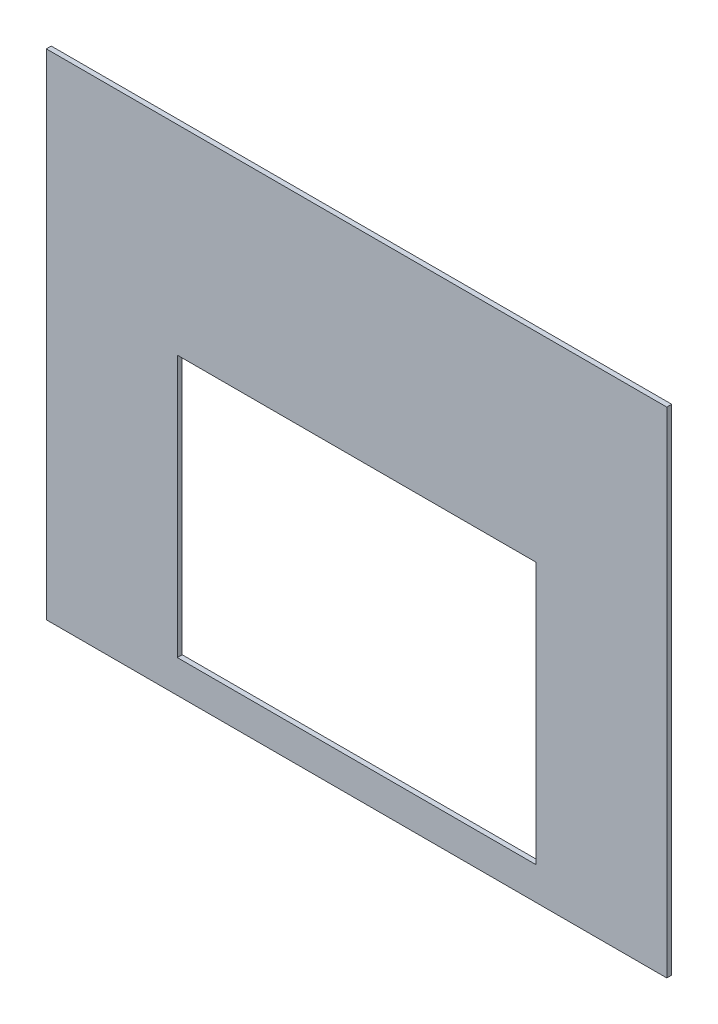
ISO-10303-21;
HEADER;
FILE_DESCRIPTION(('STEP AP214'),'2;1');
FILE_NAME('part.step','',(''),(''),'','','');
FILE_SCHEMA(('AUTOMOTIVE_DESIGN { 1 0 10303 214 1 1 1 1 }'));
ENDSEC;
DATA;
#1=APPLICATION_CONTEXT('core data for automotive mechanical design processes');
#2=APPLICATION_PROTOCOL_DEFINITION('international standard','automotive_design',2000,#1);
#3=PRODUCT_CONTEXT('',#1,'mechanical');
#4=PRODUCT('Part','Part','',(#3));
#5=PRODUCT_RELATED_PRODUCT_CATEGORY('part','',(#4));
#6=PRODUCT_DEFINITION_FORMATION('','',#4);
#7=PRODUCT_DEFINITION_CONTEXT('part definition',#1,'design');
#8=PRODUCT_DEFINITION('design','',#6,#7);
#9=PRODUCT_DEFINITION_SHAPE('','',#8);
#10=(LENGTH_UNIT() NAMED_UNIT(*) SI_UNIT(.MILLI.,.METRE.));
#11=(NAMED_UNIT(*) PLANE_ANGLE_UNIT() SI_UNIT($,.RADIAN.));
#12=(NAMED_UNIT(*) SI_UNIT($,.STERADIAN.) SOLID_ANGLE_UNIT());
#13=UNCERTAINTY_MEASURE_WITH_UNIT(LENGTH_MEASURE(1.E-05),#10,'distance_accuracy_value','');
#14=(GEOMETRIC_REPRESENTATION_CONTEXT(3) GLOBAL_UNCERTAINTY_ASSIGNED_CONTEXT((#13)) GLOBAL_UNIT_ASSIGNED_CONTEXT((#10,
#11,#12)) REPRESENTATION_CONTEXT('',''));
#15=CARTESIAN_POINT('',(0.,0.,0.));
#16=DIRECTION('',(0.,0.,1.));
#17=DIRECTION('',(1.,0.,0.));
#18=AXIS2_PLACEMENT_3D('',#15,#16,#17);
#19=CARTESIAN_POINT('',(0.,0.,3.));
#20=DIRECTION('',(0.,0.,-1.));
#21=DIRECTION('',(-1.,0.,0.));
#22=AXIS2_PLACEMENT_3D('',#19,#20,#21);
#23=PLANE('',#22);
#24=DIRECTION('',(0.,1.,0.));
#25=VECTOR('',#24,1.);
#26=CARTESIAN_POINT('',(189.5,-151.,3.));
#27=LINE('',#26,#25);
#28=CARTESIAN_POINT('',(189.5,-151.,3.));
#29=VERTEX_POINT('',#28);
#30=CARTESIAN_POINT('',(189.5,151.,3.));
#31=VERTEX_POINT('',#30);
#32=EDGE_CURVE('E133',#29,#31,#27,.T.);
#33=ORIENTED_EDGE('',*,*,#32,.T.);
#34=DIRECTION('',(-1.,0.,0.));
#35=VECTOR('',#34,1.);
#36=CARTESIAN_POINT('',(-189.5,151.,3.));
#37=LINE('',#36,#35);
#38=CARTESIAN_POINT('',(-189.5,151.,3.));
#39=VERTEX_POINT('',#38);
#40=EDGE_CURVE('E136',#31,#39,#37,.T.);
#41=ORIENTED_EDGE('',*,*,#40,.T.);
#42=DIRECTION('',(0.,-1.,0.));
#43=VECTOR('',#42,1.);
#44=CARTESIAN_POINT('',(-189.5,-151.,3.));
#45=LINE('',#44,#43);
#46=CARTESIAN_POINT('',(-189.5,-151.,3.));
#47=VERTEX_POINT('',#46);
#48=EDGE_CURVE('E139',#39,#47,#45,.T.);
#49=ORIENTED_EDGE('',*,*,#48,.T.);
#50=DIRECTION('',(1.,0.,0.));
#51=VECTOR('',#50,1.);
#52=CARTESIAN_POINT('',(-189.5,-151.,3.));
#53=LINE('',#52,#51);
#54=EDGE_CURVE('E141',#47,#29,#53,.T.);
#55=ORIENTED_EDGE('',*,*,#54,.T.);
#56=EDGE_LOOP('',(#33,#41,#49,#55));
#57=FACE_BOUND('',#56,.T.);
#58=DIRECTION('',(0.,-1.,0.));
#59=VECTOR('',#58,1.);
#60=CARTESIAN_POINT('',(-109.5,-131.,3.));
#61=LINE('',#60,#59);
#62=CARTESIAN_POINT('',(-109.5,29.,3.));
#63=VERTEX_POINT('',#62);
#64=CARTESIAN_POINT('',(-109.5,-131.,3.));
#65=VERTEX_POINT('',#64);
#66=EDGE_CURVE('E97',#63,#65,#61,.T.);
#67=ORIENTED_EDGE('',*,*,#66,.F.);
#68=DIRECTION('',(-1.,0.,0.));
#69=VECTOR('',#68,1.);
#70=CARTESIAN_POINT('',(109.5,29.,3.));
#71=LINE('',#70,#69);
#72=CARTESIAN_POINT('',(109.5,29.,3.));
#73=VERTEX_POINT('',#72);
#74=EDGE_CURVE('E119',#73,#63,#71,.T.);
#75=ORIENTED_EDGE('',*,*,#74,.F.);
#76=DIRECTION('',(0.,1.,0.));
#77=VECTOR('',#76,1.);
#78=CARTESIAN_POINT('',(109.5,-131.,3.));
#79=LINE('',#78,#77);
#80=CARTESIAN_POINT('',(109.5,-131.,3.));
#81=VERTEX_POINT('',#80);
#82=EDGE_CURVE('E117',#81,#73,#79,.T.);
#83=ORIENTED_EDGE('',*,*,#82,.F.);
#84=DIRECTION('',(1.,0.,0.));
#85=VECTOR('',#84,1.);
#86=CARTESIAN_POINT('',(109.5,-131.,3.));
#87=LINE('',#86,#85);
#88=EDGE_CURVE('E105',#65,#81,#87,.T.);
#89=ORIENTED_EDGE('',*,*,#88,.F.);
#90=EDGE_LOOP('',(#67,#75,#83,#89));
#91=FACE_BOUND('',#90,.T.);
#92=ADVANCED_FACE('F32',(#57,#91),#23,.F.);
#93=CARTESIAN_POINT('',(0.,0.,0.));
#94=DIRECTION('',(0.,0.,-1.));
#95=DIRECTION('',(-1.,0.,0.));
#96=AXIS2_PLACEMENT_3D('',#93,#94,#95);
#97=PLANE('',#96);
#98=DIRECTION('',(0.,1.,0.));
#99=VECTOR('',#98,1.);
#100=CARTESIAN_POINT('',(189.5,-151.,0.));
#101=LINE('',#100,#99);
#102=CARTESIAN_POINT('',(189.5,-151.,0.));
#103=VERTEX_POINT('',#102);
#104=CARTESIAN_POINT('',(189.5,151.,0.));
#105=VERTEX_POINT('',#104);
#106=EDGE_CURVE('E113',#103,#105,#101,.T.);
#107=ORIENTED_EDGE('',*,*,#106,.F.);
#108=DIRECTION('',(1.,0.,0.));
#109=VECTOR('',#108,1.);
#110=CARTESIAN_POINT('',(-189.5,-151.,0.));
#111=LINE('',#110,#109);
#112=CARTESIAN_POINT('',(-189.5,-151.,0.));
#113=VERTEX_POINT('',#112);
#114=EDGE_CURVE('E137',#113,#103,#111,.T.);
#115=ORIENTED_EDGE('',*,*,#114,.F.);
#116=DIRECTION('',(0.,-1.,0.));
#117=VECTOR('',#116,1.);
#118=CARTESIAN_POINT('',(-189.5,-151.,0.));
#119=LINE('',#118,#117);
#120=CARTESIAN_POINT('',(-189.5,151.,0.));
#121=VERTEX_POINT('',#120);
#122=EDGE_CURVE('E148',#121,#113,#119,.T.);
#123=ORIENTED_EDGE('',*,*,#122,.F.);
#124=DIRECTION('',(-1.,0.,0.));
#125=VECTOR('',#124,1.);
#126=CARTESIAN_POINT('',(-189.5,151.,0.));
#127=LINE('',#126,#125);
#128=EDGE_CURVE('E146',#105,#121,#127,.T.);
#129=ORIENTED_EDGE('',*,*,#128,.F.);
#130=EDGE_LOOP('',(#107,#115,#123,#129));
#131=FACE_BOUND('',#130,.T.);
#132=DIRECTION('',(-1.,0.,0.));
#133=VECTOR('',#132,1.);
#134=CARTESIAN_POINT('',(109.5,29.,0.));
#135=LINE('',#134,#133);
#136=CARTESIAN_POINT('',(109.5,29.,0.));
#137=VERTEX_POINT('',#136);
#138=CARTESIAN_POINT('',(-109.5,29.,0.));
#139=VERTEX_POINT('',#138);
#140=EDGE_CURVE('E106',#137,#139,#135,.T.);
#141=ORIENTED_EDGE('',*,*,#140,.T.);
#142=DIRECTION('',(0.,-1.,0.));
#143=VECTOR('',#142,1.);
#144=CARTESIAN_POINT('',(-109.5,-131.,0.));
#145=LINE('',#144,#143);
#146=CARTESIAN_POINT('',(-109.5,-131.,0.));
#147=VERTEX_POINT('',#146);
#148=EDGE_CURVE('E55',#139,#147,#145,.T.);
#149=ORIENTED_EDGE('',*,*,#148,.T.);
#150=DIRECTION('',(1.,0.,0.));
#151=VECTOR('',#150,1.);
#152=CARTESIAN_POINT('',(109.5,-131.,0.));
#153=LINE('',#152,#151);
#154=CARTESIAN_POINT('',(109.5,-131.,0.));
#155=VERTEX_POINT('',#154);
#156=EDGE_CURVE('E112',#147,#155,#153,.T.);
#157=ORIENTED_EDGE('',*,*,#156,.T.);
#158=DIRECTION('',(0.,1.,0.));
#159=VECTOR('',#158,1.);
#160=CARTESIAN_POINT('',(109.5,-131.,0.));
#161=LINE('',#160,#159);
#162=EDGE_CURVE('E125',#155,#137,#161,.T.);
#163=ORIENTED_EDGE('',*,*,#162,.T.);
#164=EDGE_LOOP('',(#141,#149,#157,#163));
#165=FACE_BOUND('',#164,.T.);
#166=ADVANCED_FACE('F166',(#131,#165),#97,.T.);
#167=CARTESIAN_POINT('',(189.5,-151.,3.));
#168=DIRECTION('',(-1.,0.,0.));
#169=DIRECTION('',(0.,0.,1.));
#170=AXIS2_PLACEMENT_3D('',#167,#168,#169);
#171=PLANE('',#170);
#172=ORIENTED_EDGE('',*,*,#106,.T.);
#173=DIRECTION('',(0.,0.,-1.));
#174=VECTOR('',#173,1.);
#175=CARTESIAN_POINT('',(189.5,151.,3.));
#176=LINE('',#175,#174);
#177=EDGE_CURVE('E11',#31,#105,#176,.T.);
#178=ORIENTED_EDGE('',*,*,#177,.F.);
#179=ORIENTED_EDGE('',*,*,#32,.F.);
#180=DIRECTION('',(0.,0.,-1.));
#181=VECTOR('',#180,1.);
#182=CARTESIAN_POINT('',(189.5,-151.,3.));
#183=LINE('',#182,#181);
#184=EDGE_CURVE('E143',#29,#103,#183,.T.);
#185=ORIENTED_EDGE('',*,*,#184,.T.);
#186=EDGE_LOOP('',(#172,#178,#179,#185));
#187=FACE_BOUND('',#186,.T.);
#188=ADVANCED_FACE('F34',(#187),#171,.F.);
#189=CARTESIAN_POINT('',(-189.5,151.,3.));
#190=DIRECTION('',(0.,-1.,0.));
#191=DIRECTION('',(0.,0.,-1.));
#192=AXIS2_PLACEMENT_3D('',#189,#190,#191);
#193=PLANE('',#192);
#194=ORIENTED_EDGE('',*,*,#128,.T.);
#195=DIRECTION('',(0.,0.,-1.));
#196=VECTOR('',#195,1.);
#197=CARTESIAN_POINT('',(-189.5,151.,3.));
#198=LINE('',#197,#196);
#199=EDGE_CURVE('E40',#39,#121,#198,.T.);
#200=ORIENTED_EDGE('',*,*,#199,.F.);
#201=ORIENTED_EDGE('',*,*,#40,.F.);
#202=ORIENTED_EDGE('',*,*,#177,.T.);
#203=EDGE_LOOP('',(#194,#200,#201,#202));
#204=FACE_BOUND('',#203,.T.);
#205=ADVANCED_FACE('F176',(#204),#193,.F.);
#206=CARTESIAN_POINT('',(-189.5,-151.,3.));
#207=DIRECTION('',(1.,0.,0.));
#208=DIRECTION('',(0.,0.,-1.));
#209=AXIS2_PLACEMENT_3D('',#206,#207,#208);
#210=PLANE('',#209);
#211=ORIENTED_EDGE('',*,*,#122,.T.);
#212=DIRECTION('',(0.,0.,-1.));
#213=VECTOR('',#212,1.);
#214=CARTESIAN_POINT('',(-189.5,-151.,3.));
#215=LINE('',#214,#213);
#216=EDGE_CURVE('E153',#47,#113,#215,.T.);
#217=ORIENTED_EDGE('',*,*,#216,.F.);
#218=ORIENTED_EDGE('',*,*,#48,.F.);
#219=ORIENTED_EDGE('',*,*,#199,.T.);
#220=EDGE_LOOP('',(#211,#217,#218,#219));
#221=FACE_BOUND('',#220,.T.);
#222=ADVANCED_FACE('F160',(#221),#210,.F.);
#223=CARTESIAN_POINT('',(-189.5,-151.,3.));
#224=DIRECTION('',(0.,1.,0.));
#225=DIRECTION('',(0.,0.,1.));
#226=AXIS2_PLACEMENT_3D('',#223,#224,#225);
#227=PLANE('',#226);
#228=ORIENTED_EDGE('',*,*,#114,.T.);
#229=ORIENTED_EDGE('',*,*,#184,.F.);
#230=ORIENTED_EDGE('',*,*,#54,.F.);
#231=ORIENTED_EDGE('',*,*,#216,.T.);
#232=EDGE_LOOP('',(#228,#229,#230,#231));
#233=FACE_BOUND('',#232,.T.);
#234=ADVANCED_FACE('F170',(#233),#227,.F.);
#235=CARTESIAN_POINT('',(-109.5,-131.,3.));
#236=DIRECTION('',(1.,0.,0.));
#237=DIRECTION('',(0.,0.,-1.));
#238=AXIS2_PLACEMENT_3D('',#235,#236,#237);
#239=PLANE('',#238);
#240=ORIENTED_EDGE('',*,*,#148,.F.);
#241=DIRECTION('',(0.,0.,-1.));
#242=VECTOR('',#241,1.);
#243=CARTESIAN_POINT('',(-109.5,29.,3.));
#244=LINE('',#243,#242);
#245=EDGE_CURVE('E101',#63,#139,#244,.T.);
#246=ORIENTED_EDGE('',*,*,#245,.F.);
#247=ORIENTED_EDGE('',*,*,#66,.T.);
#248=DIRECTION('',(0.,0.,-1.));
#249=VECTOR('',#248,1.);
#250=CARTESIAN_POINT('',(-109.5,-131.,3.));
#251=LINE('',#250,#249);
#252=EDGE_CURVE('E100',#65,#147,#251,.T.);
#253=ORIENTED_EDGE('',*,*,#252,.T.);
#254=EDGE_LOOP('',(#240,#246,#247,#253));
#255=FACE_BOUND('',#254,.T.);
#256=ADVANCED_FACE('F99',(#255),#239,.T.);
#257=CARTESIAN_POINT('',(109.5,-131.,3.));
#258=DIRECTION('',(0.,1.,0.));
#259=DIRECTION('',(0.,0.,1.));
#260=AXIS2_PLACEMENT_3D('',#257,#258,#259);
#261=PLANE('',#260);
#262=ORIENTED_EDGE('',*,*,#156,.F.);
#263=ORIENTED_EDGE('',*,*,#252,.F.);
#264=ORIENTED_EDGE('',*,*,#88,.T.);
#265=DIRECTION('',(0.,0.,-1.));
#266=VECTOR('',#265,1.);
#267=CARTESIAN_POINT('',(109.5,-131.,3.));
#268=LINE('',#267,#266);
#269=EDGE_CURVE('E114',#81,#155,#268,.T.);
#270=ORIENTED_EDGE('',*,*,#269,.T.);
#271=EDGE_LOOP('',(#262,#263,#264,#270));
#272=FACE_BOUND('',#271,.T.);
#273=ADVANCED_FACE('F109',(#272),#261,.T.);
#274=CARTESIAN_POINT('',(109.5,-131.,3.));
#275=DIRECTION('',(-1.,0.,0.));
#276=DIRECTION('',(0.,0.,1.));
#277=AXIS2_PLACEMENT_3D('',#274,#275,#276);
#278=PLANE('',#277);
#279=ORIENTED_EDGE('',*,*,#162,.F.);
#280=ORIENTED_EDGE('',*,*,#269,.F.);
#281=ORIENTED_EDGE('',*,*,#82,.T.);
#282=DIRECTION('',(0.,0.,-1.));
#283=VECTOR('',#282,1.);
#284=CARTESIAN_POINT('',(109.5,29.,3.));
#285=LINE('',#284,#283);
#286=EDGE_CURVE('E47',#73,#137,#285,.T.);
#287=ORIENTED_EDGE('',*,*,#286,.T.);
#288=EDGE_LOOP('',(#279,#280,#281,#287));
#289=FACE_BOUND('',#288,.T.);
#290=ADVANCED_FACE('F199',(#289),#278,.T.);
#291=CARTESIAN_POINT('',(109.5,29.,3.));
#292=DIRECTION('',(0.,-1.,0.));
#293=DIRECTION('',(1.,0.,0.));
#294=AXIS2_PLACEMENT_3D('',#291,#292,#293);
#295=PLANE('',#294);
#296=ORIENTED_EDGE('',*,*,#140,.F.);
#297=ORIENTED_EDGE('',*,*,#286,.F.);
#298=ORIENTED_EDGE('',*,*,#74,.T.);
#299=ORIENTED_EDGE('',*,*,#245,.T.);
#300=EDGE_LOOP('',(#296,#297,#298,#299));
#301=FACE_BOUND('',#300,.T.);
#302=ADVANCED_FACE('F203',(#301),#295,.T.);
#303=CLOSED_SHELL('',(#92,#166,#188,#205,#222,#234,#256,#273,#290,#302));
#304=MANIFOLD_SOLID_BREP('B2',#303);
#305=ADVANCED_BREP_SHAPE_REPRESENTATION('',(#18,#304),#14);
#306=SHAPE_DEFINITION_REPRESENTATION(#9,#305);
ENDSEC;
END-ISO-10303-21;
